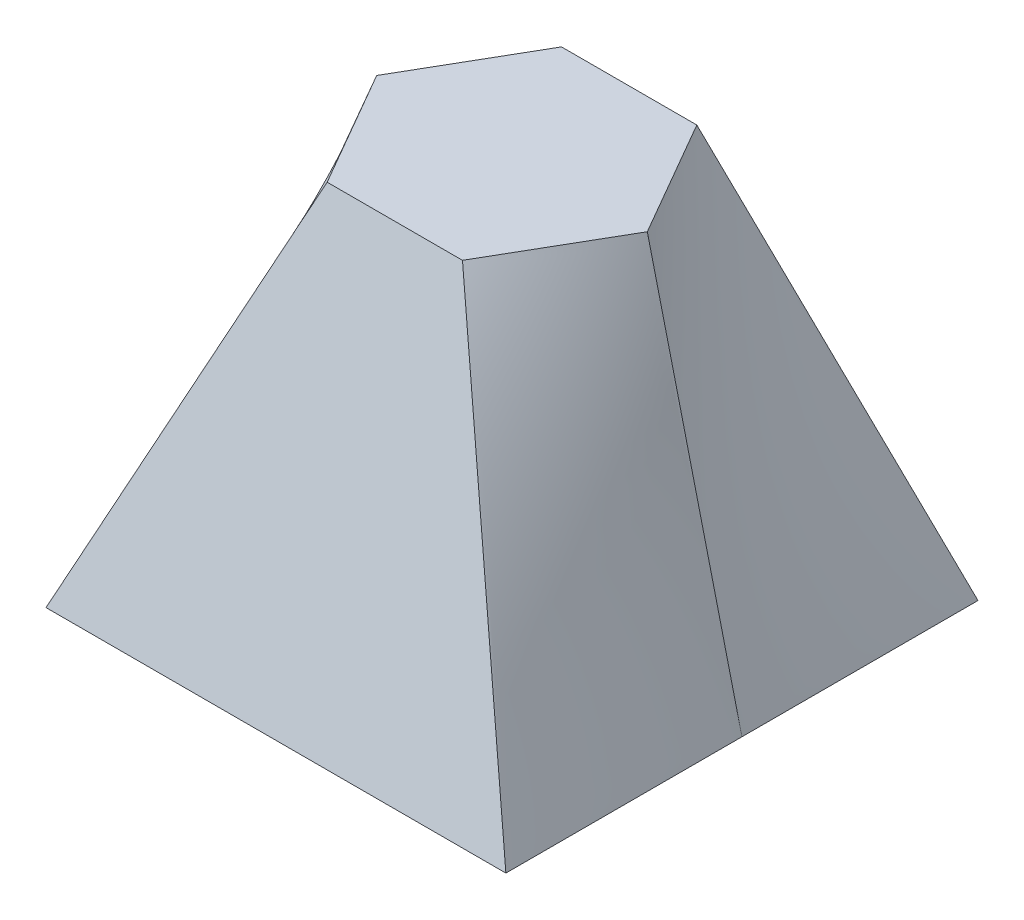
ISO-10303-21;
HEADER;
FILE_DESCRIPTION(('STEP AP214'),'2;1');
FILE_NAME('part.step','',(''),(''),'','','');
FILE_SCHEMA(('AUTOMOTIVE_DESIGN { 1 0 10303 214 1 1 1 1 }'));
ENDSEC;
DATA;
#1=APPLICATION_CONTEXT('core data for automotive mechanical design processes');
#2=APPLICATION_PROTOCOL_DEFINITION('international standard','automotive_design',2000,#1);
#3=PRODUCT_CONTEXT('',#1,'mechanical');
#4=PRODUCT('Part','Part','',(#3));
#5=PRODUCT_RELATED_PRODUCT_CATEGORY('part','',(#4));
#6=PRODUCT_DEFINITION_FORMATION('','',#4);
#7=PRODUCT_DEFINITION_CONTEXT('part definition',#1,'design');
#8=PRODUCT_DEFINITION('design','',#6,#7);
#9=PRODUCT_DEFINITION_SHAPE('','',#8);
#10=(LENGTH_UNIT() NAMED_UNIT(*) SI_UNIT(.MILLI.,.METRE.));
#11=(NAMED_UNIT(*) PLANE_ANGLE_UNIT() SI_UNIT($,.RADIAN.));
#12=(NAMED_UNIT(*) SI_UNIT($,.STERADIAN.) SOLID_ANGLE_UNIT());
#13=UNCERTAINTY_MEASURE_WITH_UNIT(LENGTH_MEASURE(1.E-05),#10,'distance_accuracy_value','');
#14=(GEOMETRIC_REPRESENTATION_CONTEXT(3) GLOBAL_UNCERTAINTY_ASSIGNED_CONTEXT((#13)) GLOBAL_UNIT_ASSIGNED_CONTEXT((#10,
#11,#12)) REPRESENTATION_CONTEXT('',''));
#15=CARTESIAN_POINT('',(0.,0.,0.));
#16=DIRECTION('',(0.,0.,1.));
#17=DIRECTION('',(1.,0.,0.));
#18=AXIS2_PLACEMENT_3D('',#15,#16,#17);
#19=CARTESIAN_POINT('',(0.,76.2,0.));
#20=DIRECTION('',(0.,1.,0.));
#21=DIRECTION('',(0.,0.,1.));
#22=AXIS2_PLACEMENT_3D('',#19,#20,#21);
#23=PLANE('',#22);
#24=DIRECTION('',(0.499999999999995,0.,-0.866025403784442));
#25=VECTOR('',#24,1.);
#26=CARTESIAN_POINT('',(13.2149918826077,76.2,22.8890373622862));
#27=LINE('',#26,#25);
#28=CARTESIAN_POINT('',(13.2149918826077,76.2,22.8890373622862));
#29=VERTEX_POINT('',#28);
#30=CARTESIAN_POINT('',(26.4299837652148,76.2,0.));
#31=VERTEX_POINT('',#30);
#32=EDGE_CURVE('E290',#29,#31,#27,.T.);
#33=ORIENTED_EDGE('',*,*,#32,.T.);
#34=DIRECTION('',(-0.500000000000001,0.,-0.866025403784438));
#35=VECTOR('',#34,1.);
#36=CARTESIAN_POINT('',(26.4299837652148,76.2,0.));
#37=LINE('',#36,#35);
#38=CARTESIAN_POINT('',(13.2149918826074,76.2,-22.8890373622864));
#39=VERTEX_POINT('',#38);
#40=EDGE_CURVE('E282',#31,#39,#37,.T.);
#41=ORIENTED_EDGE('',*,*,#40,.T.);
#42=DIRECTION('',(-1.,0.,0.));
#43=VECTOR('',#42,1.);
#44=CARTESIAN_POINT('',(13.2149918826074,76.2,-22.8890373622864));
#45=LINE('',#44,#43);
#46=CARTESIAN_POINT('',(-13.2149918826075,76.2,-22.8890373622863));
#47=VERTEX_POINT('',#46);
#48=EDGE_CURVE('E274',#39,#47,#45,.T.);
#49=ORIENTED_EDGE('',*,*,#48,.T.);
#50=DIRECTION('',(-0.499999999999995,0.,0.866025403784441));
#51=VECTOR('',#50,1.);
#52=CARTESIAN_POINT('',(-13.2149918826075,76.2,-22.8890373622863));
#53=LINE('',#52,#51);
#54=CARTESIAN_POINT('',(-26.4299837652148,76.2,1.76941794549634E-13));
#55=VERTEX_POINT('',#54);
#56=EDGE_CURVE('E138',#47,#55,#53,.T.);
#57=ORIENTED_EDGE('',*,*,#56,.T.);
#58=DIRECTION('',(0.500000000000007,0.,0.866025403784434));
#59=VECTOR('',#58,1.);
#60=CARTESIAN_POINT('',(-26.4299837652148,76.2,1.84559590204349E-13));
#61=LINE('',#60,#59);
#62=CARTESIAN_POINT('',(-13.2149918826072,76.2,22.8890373622864));
#63=VERTEX_POINT('',#62);
#64=EDGE_CURVE('E59',#55,#63,#61,.T.);
#65=ORIENTED_EDGE('',*,*,#64,.T.);
#66=DIRECTION('',(1.,0.,0.));
#67=VECTOR('',#66,1.);
#68=CARTESIAN_POINT('',(-13.2149918826072,76.2,22.8890373622864));
#69=LINE('',#68,#67);
#70=EDGE_CURVE('E12',#63,#29,#69,.T.);
#71=ORIENTED_EDGE('',*,*,#70,.T.);
#72=EDGE_LOOP('',(#33,#41,#49,#57,#65,#71));
#73=FACE_BOUND('',#72,.T.);
#74=ADVANCED_FACE('F49',(#73),#23,.T.);
#75=CARTESIAN_POINT('',(0.,0.,0.));
#76=DIRECTION('',(0.,-1.,0.));
#77=DIRECTION('',(0.,0.,-1.));
#78=AXIS2_PLACEMENT_3D('',#75,#76,#77);
#79=PLANE('',#78);
#80=DIRECTION('',(0.,0.,-1.));
#81=VECTOR('',#80,1.);
#82=CARTESIAN_POINT('',(44.9137513171536,0.,46.1105522178968));
#83=LINE('',#82,#81);
#84=CARTESIAN_POINT('',(44.9137513171536,0.,46.1105522178968));
#85=VERTEX_POINT('',#84);
#86=CARTESIAN_POINT('',(44.9137513171536,0.,0.));
#87=VERTEX_POINT('',#86);
#88=EDGE_CURVE('E197',#85,#87,#83,.T.);
#89=ORIENTED_EDGE('',*,*,#88,.F.);
#90=DIRECTION('',(1.,0.,0.));
#91=VECTOR('',#90,1.);
#92=CARTESIAN_POINT('',(-44.9137513171536,0.,46.1105522178968));
#93=LINE('',#92,#91);
#94=CARTESIAN_POINT('',(-44.9137513171536,0.,46.1105522178968));
#95=VERTEX_POINT('',#94);
#96=EDGE_CURVE('E120',#95,#85,#93,.T.);
#97=ORIENTED_EDGE('',*,*,#96,.F.);
#98=DIRECTION('',(0.,0.,1.));
#99=VECTOR('',#98,1.);
#100=CARTESIAN_POINT('',(-44.9137513171536,0.,-46.1105522178968));
#101=LINE('',#100,#99);
#102=CARTESIAN_POINT('',(-44.9137513171536,0.,0.));
#103=VERTEX_POINT('',#102);
#104=EDGE_CURVE('E114',#103,#95,#101,.T.);
#105=ORIENTED_EDGE('',*,*,#104,.F.);
#106=CARTESIAN_POINT('',(-44.9137513171536,0.,-46.1105522178968));
#107=VERTEX_POINT('',#106);
#108=EDGE_CURVE('E107',#107,#103,#101,.T.);
#109=ORIENTED_EDGE('',*,*,#108,.F.);
#110=DIRECTION('',(-1.,0.,0.));
#111=VECTOR('',#110,1.);
#112=CARTESIAN_POINT('',(-44.9137513171536,0.,-46.1105522178968));
#113=LINE('',#112,#111);
#114=CARTESIAN_POINT('',(44.9137513171536,0.,-46.1105522178968));
#115=VERTEX_POINT('',#114);
#116=EDGE_CURVE('E112',#115,#107,#113,.T.);
#117=ORIENTED_EDGE('',*,*,#116,.F.);
#118=EDGE_CURVE('E366',#87,#115,#83,.T.);
#119=ORIENTED_EDGE('',*,*,#118,.F.);
#120=EDGE_LOOP('',(#89,#97,#105,#109,#117,#119));
#121=FACE_BOUND('',#120,.T.);
#122=ADVANCED_FACE('F110',(#121),#79,.T.);
#123=CARTESIAN_POINT('',(44.9137513171536,0.,46.1105522178968));
#124=CARTESIAN_POINT('',(13.2149918826077,76.2,22.8890373622862));
#125=CARTESIAN_POINT('',(44.9137513171536,0.,38.4254601815807));
#126=CARTESIAN_POINT('',(15.4174905297089,76.2,19.0741978019051));
#127=CARTESIAN_POINT('',(44.9137513171536,0.,30.7403681452646));
#128=CARTESIAN_POINT('',(17.6199891768101,76.2,15.2593582415241));
#129=CARTESIAN_POINT('',(44.9137513171536,0.,15.3701840726323));
#130=CARTESIAN_POINT('',(22.0249864710124,76.2,7.62967912076206));
#131=CARTESIAN_POINT('',(44.9137513171536,0.,7.68509203631615));
#132=CARTESIAN_POINT('',(24.2274851181136,76.2,3.81483956038103));
#133=CARTESIAN_POINT('',(44.9137513171536,0.,0.));
#134=CARTESIAN_POINT('',(26.4299837652148,76.2,0.));
#135=B_SPLINE_SURFACE_WITH_KNOTS('',3,1,((#123,#124),(#125,#126),(#127,#128),(#129,#130),(#131,
#132),(#133,#134)),.UNSPECIFIED.,.F.,.F.,.F.,(4,2,4),(2,2),(0.,0.5,1.),(0.,1.),.UNSPECIFIED.);
#136=DIRECTION('',(-0.235733010214862,0.971817857365793,0.));
#137=VECTOR('',#136,1.);
#138=CARTESIAN_POINT('',(35.6718675411842,38.1,0.));
#139=LINE('',#138,#137);
#140=EDGE_CURVE('E143',#87,#31,#139,.T.);
#141=DIRECTION('',(0.369729511868252,-0.888785217684479,0.270852219631329));
#142=VECTOR('',#141,1.);
#143=CARTESIAN_POINT('',(29.0643715998806,38.1,34.4997947900915));
#144=LINE('',#143,#142);
#145=EDGE_CURVE('E381',#29,#85,#144,.T.);
#146=ORIENTED_EDGE('',*,*,#88,.T.);
#147=ORIENTED_EDGE('',*,*,#140,.T.);
#148=ORIENTED_EDGE('',*,*,#32,.F.);
#149=ORIENTED_EDGE('',*,*,#145,.T.);
#150=EDGE_LOOP('',(#146,#147,#148,#149));
#151=FACE_BOUND('',#150,.T.);
#152=ADVANCED_FACE('F213',(#151),#135,.T.);
#153=CARTESIAN_POINT('',(44.9137513171536,0.,0.));
#154=CARTESIAN_POINT('',(26.4299837652148,76.2,0.));
#155=CARTESIAN_POINT('',(44.9137513171536,0.,-7.68509203631613));
#156=CARTESIAN_POINT('',(24.2274851181136,76.2,-3.81483956038106));
#157=CARTESIAN_POINT('',(44.9137513171536,0.,-15.3701840726323));
#158=CARTESIAN_POINT('',(22.0249864710123,76.2,-7.62967912076212));
#159=CARTESIAN_POINT('',(44.9137513171536,0.,-30.7403681452645));
#160=CARTESIAN_POINT('',(17.6199891768098,76.2,-15.2593582415242));
#161=CARTESIAN_POINT('',(44.9137513171536,0.,-38.4254601815807));
#162=CARTESIAN_POINT('',(15.4174905297086,76.2,-19.0741978019053));
#163=CARTESIAN_POINT('',(44.9137513171536,0.,-46.1105522178968));
#164=CARTESIAN_POINT('',(13.2149918826074,76.2,-22.8890373622864));
#165=B_SPLINE_SURFACE_WITH_KNOTS('',3,1,((#153,#154),(#155,#156),(#157,#158),(#159,#160),(#161,
#162),(#163,#164)),.UNSPECIFIED.,.F.,.F.,.F.,(4,2,4),(2,2),(0.,0.5,1.),(0.,1.),.UNSPECIFIED.);
#166=DIRECTION('',(-0.369729511868255,0.888785217684478,0.270852219631327));
#167=VECTOR('',#166,1.);
#168=CARTESIAN_POINT('',(29.0643715998805,38.1,-34.4997947900916));
#169=LINE('',#168,#167);
#170=EDGE_CURVE('E132',#115,#39,#169,.T.);
#171=ORIENTED_EDGE('',*,*,#118,.T.);
#172=ORIENTED_EDGE('',*,*,#170,.T.);
#173=ORIENTED_EDGE('',*,*,#40,.F.);
#174=ORIENTED_EDGE('',*,*,#140,.F.);
#175=EDGE_LOOP('',(#171,#172,#173,#174));
#176=FACE_BOUND('',#175,.T.);
#177=ADVANCED_FACE('F328',(#176),#165,.T.);
#178=CARTESIAN_POINT('',(4.37544904061669E-13,12.8578323823071,42.1922012247647));
#179=DIRECTION('',(0.,-0.291508690388564,-0.956568180229692));
#180=DIRECTION('',(0.,0.956568180229692,-0.291508690388564));
#181=AXIS2_PLACEMENT_3D('',#178,#179,#180);
#182=PLANE('',#181);
#183=ORIENTED_EDGE('',*,*,#145,.F.);
#184=ORIENTED_EDGE('',*,*,#70,.F.);
#185=DIRECTION('',(0.369729511868257,0.888785217684478,-0.270852219631326));
#186=VECTOR('',#185,1.);
#187=CARTESIAN_POINT('',(-29.0643715998804,38.1,34.4997947900916));
#188=LINE('',#187,#186);
#189=EDGE_CURVE('E74',#95,#63,#188,.T.);
#190=ORIENTED_EDGE('',*,*,#189,.F.);
#191=ORIENTED_EDGE('',*,*,#96,.T.);
#192=EDGE_LOOP('',(#183,#184,#190,#191));
#193=FACE_BOUND('',#192,.T.);
#194=ADVANCED_FACE('F320',(#193),#182,.F.);
#195=CARTESIAN_POINT('',(-1.49540663413481E-13,12.8578323823069,-42.1922012247646));
#196=DIRECTION('',(0.,-0.29150869038856,0.956568180229693));
#197=DIRECTION('',(0.,-0.956568180229693,-0.29150869038856));
#198=AXIS2_PLACEMENT_3D('',#195,#196,#197);
#199=PLANE('',#198);
#200=DIRECTION('',(0.369729511868254,0.888785217684478,0.270852219631328));
#201=VECTOR('',#200,1.);
#202=CARTESIAN_POINT('',(-44.9137513171536,0.,-46.1105522178968));
#203=LINE('',#202,#201);
#204=EDGE_CURVE('E129',#107,#47,#203,.T.);
#205=ORIENTED_EDGE('',*,*,#204,.T.);
#206=ORIENTED_EDGE('',*,*,#48,.F.);
#207=ORIENTED_EDGE('',*,*,#170,.F.);
#208=ORIENTED_EDGE('',*,*,#116,.T.);
#209=EDGE_LOOP('',(#205,#206,#207,#208));
#210=FACE_BOUND('',#209,.T.);
#211=ADVANCED_FACE('F128',(#210),#199,.F.);
#212=CARTESIAN_POINT('',(-44.9137513171536,0.,-46.1105522178968));
#213=CARTESIAN_POINT('',(-13.2149918826075,76.2,-22.8890373622863));
#214=CARTESIAN_POINT('',(-44.9137513171536,0.,-38.4254601815807));
#215=CARTESIAN_POINT('',(-15.4174905297087,76.2,-19.0741978019052));
#216=CARTESIAN_POINT('',(-44.9137513171536,0.,-30.7403681452646));
#217=CARTESIAN_POINT('',(-17.61998917681,76.2,-15.2593582415241));
#218=CARTESIAN_POINT('',(-44.9137513171536,0.,-15.3701840726323));
#219=CARTESIAN_POINT('',(-22.0249864710124,76.2,-7.62967912076197));
#220=CARTESIAN_POINT('',(-44.9137513171536,0.,-7.68509203631615));
#221=CARTESIAN_POINT('',(-24.2274851181136,76.2,-3.8148395603809));
#222=CARTESIAN_POINT('',(-44.9137513171536,0.,0.));
#223=CARTESIAN_POINT('',(-26.4299837652148,76.2,1.76941794549634E-13));
#224=B_SPLINE_SURFACE_WITH_KNOTS('',3,1,((#212,#213),(#214,#215),(#216,#217),(#218,#219),(#220,
#221),(#222,#223)),.UNSPECIFIED.,.F.,.F.,.F.,(4,2,4),(2,2),(0.,0.5,1.),(0.,1.),.UNSPECIFIED.);
#225=DIRECTION('',(0.235733010214862,0.971817857365793,0.));
#226=VECTOR('',#225,1.);
#227=CARTESIAN_POINT('',(-35.6718675411842,38.1,0.));
#228=LINE('',#227,#226);
#229=EDGE_CURVE('E140',#103,#55,#228,.T.);
#230=ORIENTED_EDGE('',*,*,#108,.T.);
#231=ORIENTED_EDGE('',*,*,#229,.T.);
#232=ORIENTED_EDGE('',*,*,#56,.F.);
#233=ORIENTED_EDGE('',*,*,#204,.F.);
#234=EDGE_LOOP('',(#230,#231,#232,#233));
#235=FACE_BOUND('',#234,.T.);
#236=ADVANCED_FACE('F136',(#235),#224,.T.);
#237=CARTESIAN_POINT('',(-44.9137513171536,0.,0.));
#238=CARTESIAN_POINT('',(-26.4299837652148,76.2,1.84559590204349E-13));
#239=CARTESIAN_POINT('',(-44.9137513171536,0.,7.68509203631613));
#240=CARTESIAN_POINT('',(-24.2274851181136,76.2,3.81483956038123));
#241=CARTESIAN_POINT('',(-44.9137513171536,0.,15.3701840726323));
#242=CARTESIAN_POINT('',(-22.0249864710123,76.2,7.62967912076227));
#243=CARTESIAN_POINT('',(-44.9137513171536,0.,30.7403681452645));
#244=CARTESIAN_POINT('',(-17.6199891768097,76.2,15.2593582415244));
#245=CARTESIAN_POINT('',(-44.9137513171536,0.,38.4254601815807));
#246=CARTESIAN_POINT('',(-15.4174905297085,76.2,19.0741978019054));
#247=CARTESIAN_POINT('',(-44.9137513171536,0.,46.1105522178968));
#248=CARTESIAN_POINT('',(-13.2149918826072,76.2,22.8890373622864));
#249=B_SPLINE_SURFACE_WITH_KNOTS('',3,1,((#237,#238),(#239,#240),(#241,#242),(#243,#244),(#245,
#246),(#247,#248)),.UNSPECIFIED.,.F.,.F.,.F.,(4,2,4),(2,2),(0.,0.5,1.),(0.,1.),.UNSPECIFIED.);
#250=ORIENTED_EDGE('',*,*,#104,.T.);
#251=ORIENTED_EDGE('',*,*,#189,.T.);
#252=ORIENTED_EDGE('',*,*,#64,.F.);
#253=ORIENTED_EDGE('',*,*,#229,.F.);
#254=EDGE_LOOP('',(#250,#251,#252,#253));
#255=FACE_BOUND('',#254,.T.);
#256=ADVANCED_FACE('F164',(#255),#249,.T.);
#257=CLOSED_SHELL('',(#74,#122,#152,#177,#194,#211,#236,#256));
#258=MANIFOLD_SOLID_BREP('B2',#257);
#259=ADVANCED_BREP_SHAPE_REPRESENTATION('',(#18,#258),#14);
#260=SHAPE_DEFINITION_REPRESENTATION(#9,#259);
ENDSEC;
END-ISO-10303-21;
